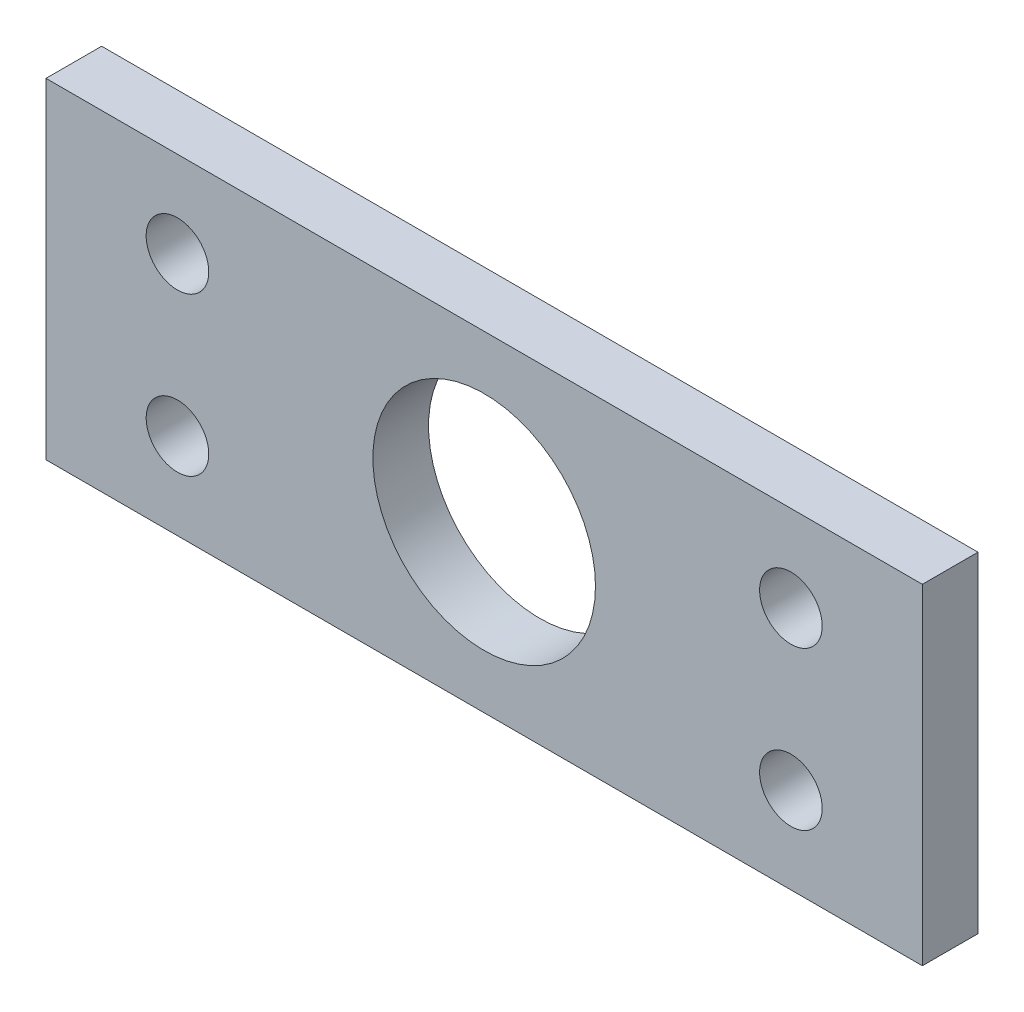
ISO-10303-21;
HEADER;
FILE_DESCRIPTION(('STEP AP214'),'2;1');
FILE_NAME('part.step','',(''),(''),'','','');
FILE_SCHEMA(('AUTOMOTIVE_DESIGN { 1 0 10303 214 1 1 1 1 }'));
ENDSEC;
DATA;
#1=APPLICATION_CONTEXT('core data for automotive mechanical design processes');
#2=APPLICATION_PROTOCOL_DEFINITION('international standard','automotive_design',2000,#1);
#3=PRODUCT_CONTEXT('',#1,'mechanical');
#4=PRODUCT('Part','Part','',(#3));
#5=PRODUCT_RELATED_PRODUCT_CATEGORY('part','',(#4));
#6=PRODUCT_DEFINITION_FORMATION('','',#4);
#7=PRODUCT_DEFINITION_CONTEXT('part definition',#1,'design');
#8=PRODUCT_DEFINITION('design','',#6,#7);
#9=PRODUCT_DEFINITION_SHAPE('','',#8);
#10=(LENGTH_UNIT() NAMED_UNIT(*) SI_UNIT(.MILLI.,.METRE.));
#11=(NAMED_UNIT(*) PLANE_ANGLE_UNIT() SI_UNIT($,.RADIAN.));
#12=(NAMED_UNIT(*) SI_UNIT($,.STERADIAN.) SOLID_ANGLE_UNIT());
#13=UNCERTAINTY_MEASURE_WITH_UNIT(LENGTH_MEASURE(1.E-05),#10,'distance_accuracy_value','');
#14=(GEOMETRIC_REPRESENTATION_CONTEXT(3) GLOBAL_UNCERTAINTY_ASSIGNED_CONTEXT((#13)) GLOBAL_UNIT_ASSIGNED_CONTEXT((#10,
#11,#12)) REPRESENTATION_CONTEXT('',''));
#15=CARTESIAN_POINT('',(0.,0.,0.));
#16=DIRECTION('',(0.,0.,1.));
#17=DIRECTION('',(1.,0.,0.));
#18=AXIS2_PLACEMENT_3D('',#15,#16,#17);
#19=CARTESIAN_POINT('',(0.,0.,12.7));
#20=DIRECTION('',(0.,0.,1.));
#21=DIRECTION('',(1.,0.,0.));
#22=AXIS2_PLACEMENT_3D('',#19,#20,#21);
#23=PLANE('',#22);
#24=CARTESIAN_POINT('',(-70.,-30.3,12.7));
#25=DIRECTION('',(0.,0.,1.));
#26=DIRECTION('',(-1.,0.,0.));
#27=AXIS2_PLACEMENT_3D('',#24,#25,#26);
#28=CIRCLE('',#27,7.14375);
#29=CARTESIAN_POINT('',(-77.14375,-30.3,12.7));
#30=VERTEX_POINT('',#29);
#31=EDGE_CURVE('E120',#30,#30,#28,.T.);
#32=ORIENTED_EDGE('',*,*,#31,.F.);
#33=EDGE_LOOP('',(#32));
#34=FACE_BOUND('',#33,.T.);
#35=CARTESIAN_POINT('',(70.,-30.2999999999999,12.7));
#36=DIRECTION('',(0.,0.,1.));
#37=DIRECTION('',(1.,0.,0.));
#38=AXIS2_PLACEMENT_3D('',#35,#36,#37);
#39=CIRCLE('',#38,7.14375000000001);
#40=CARTESIAN_POINT('',(77.14375,-30.2999999999999,12.7));
#41=VERTEX_POINT('',#40);
#42=EDGE_CURVE('E223',#41,#41,#39,.T.);
#43=ORIENTED_EDGE('',*,*,#42,.F.);
#44=EDGE_LOOP('',(#43));
#45=FACE_BOUND('',#44,.T.);
#46=CARTESIAN_POINT('',(70.,5.70000000000007,12.7));
#47=DIRECTION('',(0.,0.,1.));
#48=DIRECTION('',(-1.,0.,0.));
#49=AXIS2_PLACEMENT_3D('',#46,#47,#48);
#50=CIRCLE('',#49,7.14375);
#51=CARTESIAN_POINT('',(62.85625,5.70000000000007,12.7));
#52=VERTEX_POINT('',#51);
#53=EDGE_CURVE('E133',#52,#52,#50,.T.);
#54=ORIENTED_EDGE('',*,*,#53,.F.);
#55=EDGE_LOOP('',(#54));
#56=FACE_BOUND('',#55,.T.);
#57=CARTESIAN_POINT('',(-70.,5.69999999999999,12.7));
#58=DIRECTION('',(0.,0.,1.));
#59=DIRECTION('',(1.,0.,0.));
#60=AXIS2_PLACEMENT_3D('',#57,#58,#59);
#61=CIRCLE('',#60,7.14375);
#62=CARTESIAN_POINT('',(-62.85625,5.69999999999999,12.7));
#63=VERTEX_POINT('',#62);
#64=EDGE_CURVE('E116',#63,#63,#61,.T.);
#65=ORIENTED_EDGE('',*,*,#64,.F.);
#66=EDGE_LOOP('',(#65));
#67=FACE_BOUND('',#66,.T.);
#68=DIRECTION('',(0.,-1.,0.));
#69=VECTOR('',#68,1.);
#70=CARTESIAN_POINT('',(-100.,25.4,12.7));
#71=LINE('',#70,#69);
#72=CARTESIAN_POINT('',(-100.,25.4,12.7));
#73=VERTEX_POINT('',#72);
#74=CARTESIAN_POINT('',(-100.,-50.,12.7));
#75=VERTEX_POINT('',#74);
#76=EDGE_CURVE('E90',#73,#75,#71,.T.);
#77=ORIENTED_EDGE('',*,*,#76,.T.);
#78=DIRECTION('',(1.,0.,0.));
#79=VECTOR('',#78,1.);
#80=CARTESIAN_POINT('',(-100.,-50.,12.7));
#81=LINE('',#80,#79);
#82=CARTESIAN_POINT('',(100.,-50.,12.7));
#83=VERTEX_POINT('',#82);
#84=EDGE_CURVE('E85',#75,#83,#81,.T.);
#85=ORIENTED_EDGE('',*,*,#84,.T.);
#86=DIRECTION('',(0.,1.,0.));
#87=VECTOR('',#86,1.);
#88=CARTESIAN_POINT('',(100.,-50.,12.7));
#89=LINE('',#88,#87);
#90=CARTESIAN_POINT('',(100.,25.4,12.7));
#91=VERTEX_POINT('',#90);
#92=EDGE_CURVE('E88',#83,#91,#89,.T.);
#93=ORIENTED_EDGE('',*,*,#92,.T.);
#94=DIRECTION('',(-1.,0.,0.));
#95=VECTOR('',#94,1.);
#96=CARTESIAN_POINT('',(-100.,25.4,12.7));
#97=LINE('',#96,#95);
#98=EDGE_CURVE('E55',#91,#73,#97,.T.);
#99=ORIENTED_EDGE('',*,*,#98,.T.);
#100=EDGE_LOOP('',(#77,#85,#93,#99));
#101=FACE_BOUND('',#100,.T.);
#102=CARTESIAN_POINT('',(0.,-12.3,12.7));
#103=DIRECTION('',(0.,0.,1.));
#104=DIRECTION('',(1.,0.,0.));
#105=AXIS2_PLACEMENT_3D('',#102,#103,#104);
#106=CIRCLE('',#105,25.4);
#107=CARTESIAN_POINT('',(25.4,-12.3,12.7));
#108=VERTEX_POINT('',#107);
#109=EDGE_CURVE('E106',#108,#108,#106,.T.);
#110=ORIENTED_EDGE('',*,*,#109,.F.);
#111=EDGE_LOOP('',(#110));
#112=FACE_BOUND('',#111,.T.);
#113=ADVANCED_FACE('F36',(#34,#45,#56,#67,#101,#112),#23,.T.);
#114=CARTESIAN_POINT('',(0.,0.,0.));
#115=DIRECTION('',(0.,0.,1.));
#116=DIRECTION('',(1.,0.,0.));
#117=AXIS2_PLACEMENT_3D('',#114,#115,#116);
#118=PLANE('',#117);
#119=CARTESIAN_POINT('',(-70.,-30.3,0.));
#120=DIRECTION('',(0.,0.,1.));
#121=DIRECTION('',(1.,0.,0.));
#122=AXIS2_PLACEMENT_3D('',#119,#120,#121);
#123=CIRCLE('',#122,7.14375);
#124=CARTESIAN_POINT('',(-62.85625,-30.3,0.));
#125=VERTEX_POINT('',#124);
#126=EDGE_CURVE('E40',#125,#125,#123,.T.);
#127=ORIENTED_EDGE('',*,*,#126,.T.);
#128=EDGE_LOOP('',(#127));
#129=FACE_BOUND('',#128,.T.);
#130=CARTESIAN_POINT('',(70.,-30.2999999999999,0.));
#131=DIRECTION('',(0.,0.,1.));
#132=DIRECTION('',(1.,0.,0.));
#133=AXIS2_PLACEMENT_3D('',#130,#131,#132);
#134=CIRCLE('',#133,7.14375000000001);
#135=CARTESIAN_POINT('',(77.14375,-30.2999999999999,0.));
#136=VERTEX_POINT('',#135);
#137=EDGE_CURVE('E119',#136,#136,#134,.T.);
#138=ORIENTED_EDGE('',*,*,#137,.T.);
#139=EDGE_LOOP('',(#138));
#140=FACE_BOUND('',#139,.T.);
#141=CARTESIAN_POINT('',(70.,5.70000000000007,0.));
#142=DIRECTION('',(0.,0.,1.));
#143=DIRECTION('',(1.,0.,0.));
#144=AXIS2_PLACEMENT_3D('',#141,#142,#143);
#145=CIRCLE('',#144,7.14375);
#146=CARTESIAN_POINT('',(77.14375,5.70000000000007,0.));
#147=VERTEX_POINT('',#146);
#148=EDGE_CURVE('E117',#147,#147,#145,.T.);
#149=ORIENTED_EDGE('',*,*,#148,.T.);
#150=EDGE_LOOP('',(#149));
#151=FACE_BOUND('',#150,.T.);
#152=CARTESIAN_POINT('',(-70.,5.69999999999999,0.));
#153=DIRECTION('',(0.,0.,1.));
#154=DIRECTION('',(1.,0.,0.));
#155=AXIS2_PLACEMENT_3D('',#152,#153,#154);
#156=CIRCLE('',#155,7.14375);
#157=CARTESIAN_POINT('',(-62.85625,5.69999999999999,0.));
#158=VERTEX_POINT('',#157);
#159=EDGE_CURVE('E112',#158,#158,#156,.T.);
#160=ORIENTED_EDGE('',*,*,#159,.T.);
#161=EDGE_LOOP('',(#160));
#162=FACE_BOUND('',#161,.T.);
#163=DIRECTION('',(0.,-1.,0.));
#164=VECTOR('',#163,1.);
#165=CARTESIAN_POINT('',(-100.,25.4,0.));
#166=LINE('',#165,#164);
#167=CARTESIAN_POINT('',(-100.,25.4,0.));
#168=VERTEX_POINT('',#167);
#169=CARTESIAN_POINT('',(-100.,-50.,0.));
#170=VERTEX_POINT('',#169);
#171=EDGE_CURVE('E103',#168,#170,#166,.T.);
#172=ORIENTED_EDGE('',*,*,#171,.F.);
#173=DIRECTION('',(-1.,0.,0.));
#174=VECTOR('',#173,1.);
#175=CARTESIAN_POINT('',(-100.,25.4,0.));
#176=LINE('',#175,#174);
#177=CARTESIAN_POINT('',(100.,25.4,0.));
#178=VERTEX_POINT('',#177);
#179=EDGE_CURVE('E78',#178,#168,#176,.T.);
#180=ORIENTED_EDGE('',*,*,#179,.F.);
#181=DIRECTION('',(0.,1.,0.));
#182=VECTOR('',#181,1.);
#183=CARTESIAN_POINT('',(100.,-50.,0.));
#184=LINE('',#183,#182);
#185=CARTESIAN_POINT('',(100.,-50.,0.));
#186=VERTEX_POINT('',#185);
#187=EDGE_CURVE('E72',#186,#178,#184,.T.);
#188=ORIENTED_EDGE('',*,*,#187,.F.);
#189=DIRECTION('',(1.,0.,0.));
#190=VECTOR('',#189,1.);
#191=CARTESIAN_POINT('',(-100.,-50.,0.));
#192=LINE('',#191,#190);
#193=EDGE_CURVE('E94',#170,#186,#192,.T.);
#194=ORIENTED_EDGE('',*,*,#193,.F.);
#195=EDGE_LOOP('',(#172,#180,#188,#194));
#196=FACE_BOUND('',#195,.T.);
#197=CARTESIAN_POINT('',(0.,-12.3,0.));
#198=DIRECTION('',(0.,0.,1.));
#199=DIRECTION('',(1.,0.,0.));
#200=AXIS2_PLACEMENT_3D('',#197,#198,#199);
#201=CIRCLE('',#200,25.4);
#202=CARTESIAN_POINT('',(25.4,-12.3,0.));
#203=VERTEX_POINT('',#202);
#204=EDGE_CURVE('E115',#203,#203,#201,.T.);
#205=ORIENTED_EDGE('',*,*,#204,.T.);
#206=EDGE_LOOP('',(#205));
#207=FACE_BOUND('',#206,.T.);
#208=ADVANCED_FACE('F140',(#129,#140,#151,#162,#196,#207),#118,.F.);
#209=CARTESIAN_POINT('',(-100.,25.4,12.7));
#210=DIRECTION('',(1.,0.,0.));
#211=DIRECTION('',(0.,1.,0.));
#212=AXIS2_PLACEMENT_3D('',#209,#210,#211);
#213=PLANE('',#212);
#214=ORIENTED_EDGE('',*,*,#171,.T.);
#215=DIRECTION('',(0.,0.,-1.));
#216=VECTOR('',#215,1.);
#217=CARTESIAN_POINT('',(-100.,-50.,12.7));
#218=LINE('',#217,#216);
#219=EDGE_CURVE('E11',#75,#170,#218,.T.);
#220=ORIENTED_EDGE('',*,*,#219,.F.);
#221=ORIENTED_EDGE('',*,*,#76,.F.);
#222=DIRECTION('',(0.,0.,-1.));
#223=VECTOR('',#222,1.);
#224=CARTESIAN_POINT('',(-100.,25.4,12.7));
#225=LINE('',#224,#223);
#226=EDGE_CURVE('E99',#73,#168,#225,.T.);
#227=ORIENTED_EDGE('',*,*,#226,.T.);
#228=EDGE_LOOP('',(#214,#220,#221,#227));
#229=FACE_BOUND('',#228,.T.);
#230=ADVANCED_FACE('F38',(#229),#213,.F.);
#231=CARTESIAN_POINT('',(-100.,-50.,12.7));
#232=DIRECTION('',(0.,1.,0.));
#233=DIRECTION('',(0.,0.,1.));
#234=AXIS2_PLACEMENT_3D('',#231,#232,#233);
#235=PLANE('',#234);
#236=ORIENTED_EDGE('',*,*,#193,.T.);
#237=DIRECTION('',(0.,0.,-1.));
#238=VECTOR('',#237,1.);
#239=CARTESIAN_POINT('',(100.,-50.,12.7));
#240=LINE('',#239,#238);
#241=EDGE_CURVE('E46',#83,#186,#240,.T.);
#242=ORIENTED_EDGE('',*,*,#241,.F.);
#243=ORIENTED_EDGE('',*,*,#84,.F.);
#244=ORIENTED_EDGE('',*,*,#219,.T.);
#245=EDGE_LOOP('',(#236,#242,#243,#244));
#246=FACE_BOUND('',#245,.T.);
#247=ADVANCED_FACE('F93',(#246),#235,.F.);
#248=CARTESIAN_POINT('',(100.,-50.,12.7));
#249=DIRECTION('',(-1.,0.,0.));
#250=DIRECTION('',(0.,-1.,0.));
#251=AXIS2_PLACEMENT_3D('',#248,#249,#250);
#252=PLANE('',#251);
#253=ORIENTED_EDGE('',*,*,#187,.T.);
#254=DIRECTION('',(0.,0.,-1.));
#255=VECTOR('',#254,1.);
#256=CARTESIAN_POINT('',(100.,25.4,12.7));
#257=LINE('',#256,#255);
#258=EDGE_CURVE('E95',#91,#178,#257,.T.);
#259=ORIENTED_EDGE('',*,*,#258,.F.);
#260=ORIENTED_EDGE('',*,*,#92,.F.);
#261=ORIENTED_EDGE('',*,*,#241,.T.);
#262=EDGE_LOOP('',(#253,#259,#260,#261));
#263=FACE_BOUND('',#262,.T.);
#264=ADVANCED_FACE('F97',(#263),#252,.F.);
#265=CARTESIAN_POINT('',(-100.,25.4,12.7));
#266=DIRECTION('',(0.,-1.,0.));
#267=DIRECTION('',(1.,0.,0.));
#268=AXIS2_PLACEMENT_3D('',#265,#266,#267);
#269=PLANE('',#268);
#270=ORIENTED_EDGE('',*,*,#179,.T.);
#271=ORIENTED_EDGE('',*,*,#226,.F.);
#272=ORIENTED_EDGE('',*,*,#98,.F.);
#273=ORIENTED_EDGE('',*,*,#258,.T.);
#274=EDGE_LOOP('',(#270,#271,#272,#273));
#275=FACE_BOUND('',#274,.T.);
#276=ADVANCED_FACE('F145',(#275),#269,.F.);
#277=CARTESIAN_POINT('',(0.,-12.3,12.7));
#278=DIRECTION('',(0.,0.,-1.));
#279=DIRECTION('',(-1.,0.,0.));
#280=AXIS2_PLACEMENT_3D('',#277,#278,#279);
#281=CYLINDRICAL_SURFACE('',#280,25.4);
#282=ORIENTED_EDGE('',*,*,#109,.T.);
#283=EDGE_LOOP('',(#282));
#284=FACE_BOUND('',#283,.T.);
#285=ORIENTED_EDGE('',*,*,#204,.F.);
#286=EDGE_LOOP('',(#285));
#287=FACE_BOUND('',#286,.T.);
#288=ADVANCED_FACE('F142',(#284,#287),#281,.F.);
#289=CARTESIAN_POINT('',(-70.,5.69999999999999,-2.3));
#290=DIRECTION('',(0.,0.,1.));
#291=DIRECTION('',(1.,0.,0.));
#292=AXIS2_PLACEMENT_3D('',#289,#290,#291);
#293=CYLINDRICAL_SURFACE('',#292,7.14375);
#294=ORIENTED_EDGE('',*,*,#64,.T.);
#295=EDGE_LOOP('',(#294));
#296=FACE_BOUND('',#295,.T.);
#297=ORIENTED_EDGE('',*,*,#159,.F.);
#298=EDGE_LOOP('',(#297));
#299=FACE_BOUND('',#298,.T.);
#300=ADVANCED_FACE('F144',(#296,#299),#293,.F.);
#301=CARTESIAN_POINT('',(70.,5.70000000000007,-2.3));
#302=DIRECTION('',(0.,0.,1.));
#303=DIRECTION('',(1.,0.,0.));
#304=AXIS2_PLACEMENT_3D('',#301,#302,#303);
#305=CYLINDRICAL_SURFACE('',#304,7.14375);
#306=ORIENTED_EDGE('',*,*,#53,.T.);
#307=EDGE_LOOP('',(#306));
#308=FACE_BOUND('',#307,.T.);
#309=ORIENTED_EDGE('',*,*,#148,.F.);
#310=EDGE_LOOP('',(#309));
#311=FACE_BOUND('',#310,.T.);
#312=ADVANCED_FACE('F152',(#308,#311),#305,.F.);
#313=CARTESIAN_POINT('',(70.,-30.2999999999999,-2.3));
#314=DIRECTION('',(0.,0.,1.));
#315=DIRECTION('',(1.,0.,0.));
#316=AXIS2_PLACEMENT_3D('',#313,#314,#315);
#317=CYLINDRICAL_SURFACE('',#316,7.14375000000001);
#318=ORIENTED_EDGE('',*,*,#42,.T.);
#319=EDGE_LOOP('',(#318));
#320=FACE_BOUND('',#319,.T.);
#321=ORIENTED_EDGE('',*,*,#137,.F.);
#322=EDGE_LOOP('',(#321));
#323=FACE_BOUND('',#322,.T.);
#324=ADVANCED_FACE('F197',(#320,#323),#317,.F.);
#325=CARTESIAN_POINT('',(-70.,-30.3,-2.3));
#326=DIRECTION('',(0.,0.,1.));
#327=DIRECTION('',(1.,0.,0.));
#328=AXIS2_PLACEMENT_3D('',#325,#326,#327);
#329=CYLINDRICAL_SURFACE('',#328,7.14375);
#330=ORIENTED_EDGE('',*,*,#31,.T.);
#331=EDGE_LOOP('',(#330));
#332=FACE_BOUND('',#331,.T.);
#333=ORIENTED_EDGE('',*,*,#126,.F.);
#334=EDGE_LOOP('',(#333));
#335=FACE_BOUND('',#334,.T.);
#336=ADVANCED_FACE('F207',(#332,#335),#329,.F.);
#337=CLOSED_SHELL('',(#113,#208,#230,#247,#264,#276,#288,#300,#312,#324,#336));
#338=MANIFOLD_SOLID_BREP('B2',#337);
#339=ADVANCED_BREP_SHAPE_REPRESENTATION('',(#18,#338),#14);
#340=SHAPE_DEFINITION_REPRESENTATION(#9,#339);
ENDSEC;
END-ISO-10303-21;
